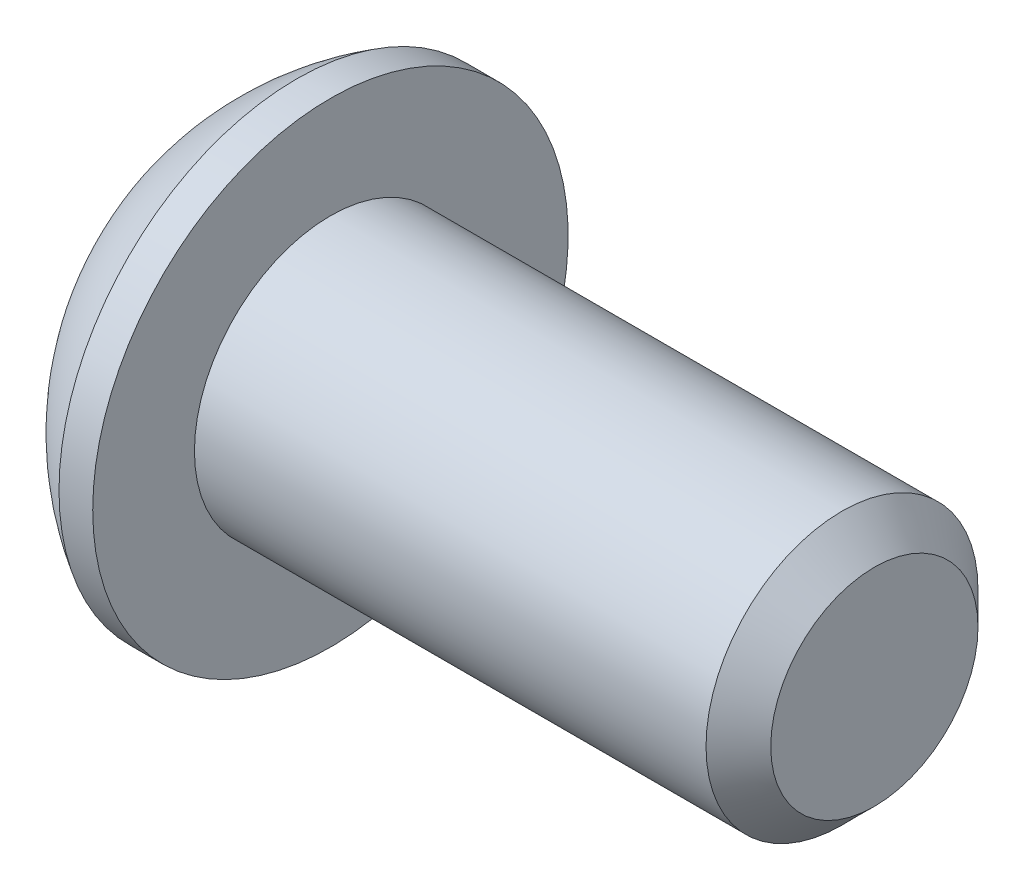
ISO-10303-21;
HEADER;
FILE_DESCRIPTION(('STEP AP214'),'2;1');
FILE_NAME('part.step','',(''),(''),'','','');
FILE_SCHEMA(('AUTOMOTIVE_DESIGN { 1 0 10303 214 1 1 1 1 }'));
ENDSEC;
DATA;
#1=APPLICATION_CONTEXT('core data for automotive mechanical design processes');
#2=APPLICATION_PROTOCOL_DEFINITION('international standard','automotive_design',2000,#1);
#3=PRODUCT_CONTEXT('',#1,'mechanical');
#4=PRODUCT('Part','Part','',(#3));
#5=PRODUCT_RELATED_PRODUCT_CATEGORY('part','',(#4));
#6=PRODUCT_DEFINITION_FORMATION('','',#4);
#7=PRODUCT_DEFINITION_CONTEXT('part definition',#1,'design');
#8=PRODUCT_DEFINITION('design','',#6,#7);
#9=PRODUCT_DEFINITION_SHAPE('','',#8);
#10=(LENGTH_UNIT() NAMED_UNIT(*) SI_UNIT(.MILLI.,.METRE.));
#11=(NAMED_UNIT(*) PLANE_ANGLE_UNIT() SI_UNIT($,.RADIAN.));
#12=(NAMED_UNIT(*) SI_UNIT($,.STERADIAN.) SOLID_ANGLE_UNIT());
#13=UNCERTAINTY_MEASURE_WITH_UNIT(LENGTH_MEASURE(1.E-05),#10,'distance_accuracy_value','');
#14=(GEOMETRIC_REPRESENTATION_CONTEXT(3) GLOBAL_UNCERTAINTY_ASSIGNED_CONTEXT((#13)) GLOBAL_UNIT_ASSIGNED_CONTEXT((#10,
#11,#12)) REPRESENTATION_CONTEXT('',''));
#15=CARTESIAN_POINT('',(0.,0.,0.));
#16=DIRECTION('',(0.,0.,1.));
#17=DIRECTION('',(1.,0.,0.));
#18=AXIS2_PLACEMENT_3D('',#15,#16,#17);
#19=CARTESIAN_POINT('',(0.,0.,0.));
#20=DIRECTION('',(-1.,0.,0.));
#21=DIRECTION('',(0.,0.,1.));
#22=AXIS2_PLACEMENT_3D('',#19,#20,#21);
#23=PLANE('',#22);
#24=CARTESIAN_POINT('',(0.,0.,0.));
#25=DIRECTION('',(-1.,0.,0.));
#26=DIRECTION('',(0.,0.,1.));
#27=AXIS2_PLACEMENT_3D('',#24,#25,#26);
#28=CIRCLE('',#27,2.77495);
#29=CARTESIAN_POINT('',(0.,2.77495,0.));
#30=VERTEX_POINT('',#29);
#31=EDGE_CURVE('E11',#30,#30,#28,.T.);
#32=ORIENTED_EDGE('',*,*,#31,.T.);
#33=EDGE_LOOP('',(#32));
#34=FACE_BOUND('',#33,.T.);
#35=DIRECTION('',(0.,-1.,0.));
#36=VECTOR('',#35,1.);
#37=CARTESIAN_POINT('',(0.,-1.14384635331849,1.9812));
#38=LINE('',#37,#36);
#39=CARTESIAN_POINT('',(0.,1.14384635331849,1.9812));
#40=VERTEX_POINT('',#39);
#41=CARTESIAN_POINT('',(0.,-1.14384635331849,1.9812));
#42=VERTEX_POINT('',#41);
#43=EDGE_CURVE('E47',#40,#42,#38,.T.);
#44=ORIENTED_EDGE('',*,*,#43,.T.);
#45=DIRECTION('',(0.,-0.5,-0.866025403784439));
#46=VECTOR('',#45,1.);
#47=CARTESIAN_POINT('',(0.,-2.28769270663697,0.));
#48=LINE('',#47,#46);
#49=CARTESIAN_POINT('',(0.,-2.28769270663697,0.));
#50=VERTEX_POINT('',#49);
#51=EDGE_CURVE('E368',#42,#50,#48,.T.);
#52=ORIENTED_EDGE('',*,*,#51,.T.);
#53=DIRECTION('',(0.,0.5,-0.866025403784439));
#54=VECTOR('',#53,1.);
#55=CARTESIAN_POINT('',(0.,-1.14384635331849,-1.9812));
#56=LINE('',#55,#54);
#57=CARTESIAN_POINT('',(0.,-1.14384635331849,-1.9812));
#58=VERTEX_POINT('',#57);
#59=EDGE_CURVE('E132',#50,#58,#56,.T.);
#60=ORIENTED_EDGE('',*,*,#59,.T.);
#61=DIRECTION('',(0.,1.,0.));
#62=VECTOR('',#61,1.);
#63=CARTESIAN_POINT('',(0.,1.14384635331849,-1.9812));
#64=LINE('',#63,#62);
#65=CARTESIAN_POINT('',(0.,1.14384635331849,-1.9812));
#66=VERTEX_POINT('',#65);
#67=EDGE_CURVE('E371',#58,#66,#64,.T.);
#68=ORIENTED_EDGE('',*,*,#67,.T.);
#69=DIRECTION('',(0.,0.5,0.866025403784439));
#70=VECTOR('',#69,1.);
#71=CARTESIAN_POINT('',(0.,2.28769270663697,0.));
#72=LINE('',#71,#70);
#73=CARTESIAN_POINT('',(0.,2.28769270663697,0.));
#74=VERTEX_POINT('',#73);
#75=EDGE_CURVE('E373',#66,#74,#72,.T.);
#76=ORIENTED_EDGE('',*,*,#75,.T.);
#77=DIRECTION('',(0.,-0.5,0.866025403784439));
#78=VECTOR('',#77,1.);
#79=CARTESIAN_POINT('',(0.,1.14384635331849,1.9812));
#80=LINE('',#79,#78);
#81=EDGE_CURVE('E375',#74,#40,#80,.T.);
#82=ORIENTED_EDGE('',*,*,#81,.T.);
#83=EDGE_LOOP('',(#44,#52,#60,#68,#76,#82));
#84=FACE_BOUND('',#83,.T.);
#85=ADVANCED_FACE('F33',(#34,#84),#23,.T.);
#86=CARTESIAN_POINT('',(5.78512506188119,0.,0.));
#87=DIRECTION('',(-1.,0.,0.));
#88=DIRECTION('',(0.,1.,0.));
#89=AXIS2_PLACEMENT_3D('',#86,#87,#88);
#90=SPHERICAL_SURFACE('',#89,6.41623094067739);
#91=CARTESIAN_POINT('',(2.5654,0.,0.));
#92=DIRECTION('',(-1.,0.,0.));
#93=DIRECTION('',(0.,0.,1.));
#94=AXIS2_PLACEMENT_3D('',#91,#92,#93);
#95=CIRCLE('',#94,5.5499);
#96=CARTESIAN_POINT('',(2.5654,5.5499,0.));
#97=VERTEX_POINT('',#96);
#98=EDGE_CURVE('E40',#97,#97,#95,.T.);
#99=CARTESIAN_POINT('',(2.5654,5.5499,0.));
#100=CARTESIAN_POINT('',(2.53083708566419,5.52984868712258,0.));
#101=CARTESIAN_POINT('',(2.49646152825914,5.50947442663449,0.));
#102=CARTESIAN_POINT('',(2.42809701945272,5.46808729773921,0.));
#103=CARTESIAN_POINT('',(2.39410806805135,5.44707442933201,0.));
#104=CARTESIAN_POINT('',(2.32652866339446,5.40441737190071,0.));
#105=CARTESIAN_POINT('',(2.29293821013895,5.38277318287661,0.));
#106=CARTESIAN_POINT('',(2.22616751866502,5.33886105159856,0.));
#107=CARTESIAN_POINT('',(2.19298728044662,5.3165931093446,0.));
#108=CARTESIAN_POINT('',(2.12704860244366,5.27144124070729,0.));
#109=CARTESIAN_POINT('',(2.09429016265911,5.24855731432393,0.));
#110=CARTESIAN_POINT('',(2.02920651509859,5.20218146582175,0.));
#111=CARTESIAN_POINT('',(1.99688130732261,5.17868954370292,0.));
#112=CARTESIAN_POINT('',(1.93267540683267,5.13110590319174,0.));
#113=CARTESIAN_POINT('',(1.90079471411871,5.10701418479938,0.));
#114=CARTESIAN_POINT('',(1.83748897146475,5.05823936086599,0.));
#115=CARTESIAN_POINT('',(1.80606392152474,5.03355625532495,0.));
#116=CARTESIAN_POINT('',(1.74368043314138,4.98360727255644,0.));
#117=CARTESIAN_POINT('',(1.71272199469802,4.95834139532897,0.));
#118=CARTESIAN_POINT('',(1.65128253514951,4.90723568808467,0.));
#119=CARTESIAN_POINT('',(1.62080151404435,4.88139585806785,0.));
#120=CARTESIAN_POINT('',(1.56032752837792,4.82915126447053,0.));
#121=CARTESIAN_POINT('',(1.53033456381664,4.80274650089003,0.));
#122=CARTESIAN_POINT('',(1.4708471600897,4.74938125657909,0.));
#123=CARTESIAN_POINT('',(1.44135272092403,4.72242077584864,0.));
#124=CARTESIAN_POINT('',(1.38287266283316,4.6679535076206,0.));
#125=CARTESIAN_POINT('',(1.35388704390797,4.64044672012299,0.));
#126=CARTESIAN_POINT('',(1.29643474354243,4.58489643942842,0.));
#127=CARTESIAN_POINT('',(1.26796806210209,4.55685294623144,0.));
#128=CARTESIAN_POINT('',(1.21156357281885,4.50023904253955,0.));
#129=CARTESIAN_POINT('',(1.18362576497595,4.47166863204464,0.));
#130=CARTESIAN_POINT('',(1.12828877440023,4.41401086607543,0.));
#131=CARTESIAN_POINT('',(1.10088959166741,4.38492351060113,0.));
#132=CARTESIAN_POINT('',(1.04663941482087,4.32624200742802,0.));
#133=CARTESIAN_POINT('',(1.01978842070714,4.2966478597292,0.));
#134=CARTESIAN_POINT('',(0.966643993266067,4.2369631017545,0.));
#135=CARTESIAN_POINT('',(0.940350559938718,4.20687249147862,0.));
#136=CARTESIAN_POINT('',(0.888330431624667,4.14620531128432,0.));
#137=CARTESIAN_POINT('',(0.862603736637965,4.11562874136591,0.));
#138=CARTESIAN_POINT('',(0.811726064743086,4.05400031444217,0.));
#139=CARTESIAN_POINT('',(0.786575087834909,4.02294845743684,0.));
#140=CARTESIAN_POINT('',(0.736857630884289,3.96038029479081,0.));
#141=CARTESIAN_POINT('',(0.712291150841846,3.9288639891501,0.));
#142=CARTESIAN_POINT('',(0.663751262394899,3.8653779297977,0.));
#143=CARTESIAN_POINT('',(0.639777853990395,3.833408176086,0.));
#144=CARTESIAN_POINT('',(0.592432476584126,3.76902637942894,0.));
#145=CARTESIAN_POINT('',(0.569060507582361,3.73661433648358,0.));
#146=CARTESIAN_POINT('',(0.522926166816146,3.67135927457555,0.));
#147=CARTESIAN_POINT('',(0.500163795051695,3.63851625561289,0.));
#148=CARTESIAN_POINT('',(0.455256593824863,3.57241070531295,0.));
#149=CARTESIAN_POINT('',(0.433111764362481,3.53914817397566,0.));
#150=CARTESIAN_POINT('',(0.389447377232277,3.47221520900886,0.));
#151=CARTESIAN_POINT('',(0.367927819564455,3.43854477537934,0.));
#152=CARTESIAN_POINT('',(0.325521487354905,3.37080775824281,0.));
#153=CARTESIAN_POINT('',(0.304634712813177,3.3367411747358,0.));
#154=CARTESIAN_POINT('',(0.263501236996926,3.26822374869429,0.));
#155=CARTESIAN_POINT('',(0.243254535722402,3.23377290615979,0.));
#156=CARTESIAN_POINT('',(0.203408274368181,3.16449898643303,0.));
#157=CARTESIAN_POINT('',(0.183808714288484,3.12967590924076,0.));
#158=CARTESIAN_POINT('',(0.145263572892659,3.05966967674634,0.));
#159=CARTESIAN_POINT('',(0.126317991576532,3.02448652144418,0.));
#160=CARTESIAN_POINT('',(0.0890874337230973,2.95377240655615,0.));
#161=CARTESIAN_POINT('',(0.0708024571857898,2.91824144697028,0.));
#162=CARTESIAN_POINT('',(0.0348994419493877,2.84684415010637,0.));
#163=CARTESIAN_POINT('',(0.0172814032502931,2.81097781282834,0.));
#164=CARTESIAN_POINT('',(0.,2.77495,0.));
#165=B_SPLINE_CURVE_WITH_KNOTS('',3,(#99,#100,#101,#102,#103,#104,#105,#106,#107,#108,#109,#110,
#111,#112,#113,#114,#115,#116,#117,#118,#119,#120,#121,#122,#123,#124,#125,#126,#127,#128,#129,
#130,#131,#132,#133,#134,#135,#136,#137,#138,#139,#140,#141,#142,#143,#144,#145,#146,#147,#148,
#149,#150,#151,#152,#153,#154,#155,#156,#157,#158,#159,#160,#161,#162,#163,#164),.UNSPECIFIED.,
.F.,.F.,(4,2,2,2,2,2,2,2,2,2,2,2,2,2,2,2,2,2,2,2,2,2,2,2,2,2,2,2,2,2,2,2,4),(0.,
0.119872570538485,0.239745141076969,0.359617711615453,0.479490282153938,0.599362852692422,
0.719235423230905,0.83910799376939,0.958980564307875,1.07885313484636,1.19872570538484,
1.31859827592333,1.43847084646181,1.5583434170003,1.67821598753878,1.79808855807726,
1.91796112861575,2.03783369915423,2.15770626969272,2.2775788402312,2.39745141076968,
2.51732398130817,2.63719655184665,2.75706912238514,2.87694169292362,2.99681426346211,
3.11668683400059,3.23655940453908,3.35643197507756,3.47630454561604,3.59617711615453,
3.71604968669301,3.8359222572315),.UNSPECIFIED.);
#166=EDGE_CURVE('BSEAM159',#97,#30,#165,.T.);
#167=ORIENTED_EDGE('',*,*,#98,.T.);
#168=ORIENTED_EDGE('',*,*,#31,.F.);
#169=ORIENTED_EDGE('',*,*,#166,.T.);
#170=ORIENTED_EDGE('',*,*,#166,.F.);
#171=EDGE_LOOP('',(#167,#169,#168,#170));
#172=FACE_BOUND('',#171,.T.);
#173=ADVANCED_FACE('F159',(#172),#90,.T.);
#174=CARTESIAN_POINT('',(0.,0.,0.));
#175=DIRECTION('',(-1.,0.,0.));
#176=DIRECTION('',(0.,0.,1.));
#177=AXIS2_PLACEMENT_3D('',#174,#175,#176);
#178=CYLINDRICAL_SURFACE('',#177,5.5499);
#179=ORIENTED_EDGE('',*,*,#98,.F.);
#180=EDGE_LOOP('',(#179));
#181=FACE_BOUND('',#180,.T.);
#182=CARTESIAN_POINT('',(3.3528,0.,0.));
#183=DIRECTION('',(-1.,0.,0.));
#184=DIRECTION('',(0.,0.,1.));
#185=AXIS2_PLACEMENT_3D('',#182,#183,#184);
#186=CIRCLE('',#185,5.5499);
#187=CARTESIAN_POINT('',(3.3528,0.,5.5499));
#188=VERTEX_POINT('',#187);
#189=EDGE_CURVE('E154',#188,#188,#186,.T.);
#190=ORIENTED_EDGE('',*,*,#189,.T.);
#191=EDGE_LOOP('',(#190));
#192=FACE_BOUND('',#191,.T.);
#193=ADVANCED_FACE('F162',(#181,#192),#178,.T.);
#194=CARTESIAN_POINT('',(3.3528,3.175,0.));
#195=DIRECTION('',(-1.,0.,0.));
#196=DIRECTION('',(0.,0.,1.));
#197=AXIS2_PLACEMENT_3D('',#194,#195,#196);
#198=PLANE('',#197);
#199=ORIENTED_EDGE('',*,*,#189,.F.);
#200=EDGE_LOOP('',(#199));
#201=FACE_BOUND('',#200,.T.);
#202=CARTESIAN_POINT('',(3.3528,0.,0.));
#203=DIRECTION('',(-1.,0.,0.));
#204=DIRECTION('',(0.,0.,1.));
#205=AXIS2_PLACEMENT_3D('',#202,#203,#204);
#206=CIRCLE('',#205,3.175);
#207=CARTESIAN_POINT('',(3.3528,0.,3.175));
#208=VERTEX_POINT('',#207);
#209=EDGE_CURVE('E151',#208,#208,#206,.T.);
#210=ORIENTED_EDGE('',*,*,#209,.T.);
#211=EDGE_LOOP('',(#210));
#212=FACE_BOUND('',#211,.T.);
#213=ADVANCED_FACE('F165',(#201,#212),#198,.F.);
#214=CARTESIAN_POINT('',(0.,0.,0.));
#215=DIRECTION('',(-1.,0.,0.));
#216=DIRECTION('',(0.,0.,1.));
#217=AXIS2_PLACEMENT_3D('',#214,#215,#216);
#218=CYLINDRICAL_SURFACE('',#217,3.175);
#219=ORIENTED_EDGE('',*,*,#209,.F.);
#220=EDGE_LOOP('',(#219));
#221=FACE_BOUND('',#220,.T.);
#222=CARTESIAN_POINT('',(15.29715,0.,0.));
#223=DIRECTION('',(-1.,0.,0.));
#224=DIRECTION('',(0.,0.,1.));
#225=AXIS2_PLACEMENT_3D('',#222,#223,#224);
#226=CIRCLE('',#225,3.175);
#227=CARTESIAN_POINT('',(15.29715,0.,3.175));
#228=VERTEX_POINT('',#227);
#229=EDGE_CURVE('E148',#228,#228,#226,.T.);
#230=ORIENTED_EDGE('',*,*,#229,.T.);
#231=EDGE_LOOP('',(#230));
#232=FACE_BOUND('',#231,.T.);
#233=ADVANCED_FACE('F171',(#221,#232),#218,.T.);
#234=CARTESIAN_POINT('',(16.0528,0.,0.));
#235=DIRECTION('',(-1.,0.,0.));
#236=DIRECTION('',(0.,0.,1.));
#237=AXIS2_PLACEMENT_3D('',#234,#235,#236);
#238=CONICAL_SURFACE('',#237,2.41935,0.785398163397445);
#239=ORIENTED_EDGE('',*,*,#229,.F.);
#240=EDGE_LOOP('',(#239));
#241=FACE_BOUND('',#240,.T.);
#242=CARTESIAN_POINT('',(16.0528,0.,0.));
#243=DIRECTION('',(-1.,0.,0.));
#244=DIRECTION('',(0.,0.,1.));
#245=AXIS2_PLACEMENT_3D('',#242,#243,#244);
#246=CIRCLE('',#245,2.41935);
#247=CARTESIAN_POINT('',(16.0528,0.,2.41935));
#248=VERTEX_POINT('',#247);
#249=EDGE_CURVE('E144',#248,#248,#246,.T.);
#250=ORIENTED_EDGE('',*,*,#249,.T.);
#251=EDGE_LOOP('',(#250));
#252=FACE_BOUND('',#251,.T.);
#253=ADVANCED_FACE('F177',(#241,#252),#238,.T.);
#254=CARTESIAN_POINT('',(16.0528,0.,0.));
#255=DIRECTION('',(-1.,0.,0.));
#256=DIRECTION('',(0.,0.,1.));
#257=AXIS2_PLACEMENT_3D('',#254,#255,#256);
#258=PLANE('',#257);
#259=ORIENTED_EDGE('',*,*,#249,.F.);
#260=EDGE_LOOP('',(#259));
#261=FACE_BOUND('',#260,.T.);
#262=ADVANCED_FACE('F183',(#261),#258,.F.);
#263=CARTESIAN_POINT('',(2.2098,-2.28769270663697,0.));
#264=DIRECTION('',(0.,0.866025403784439,-0.5));
#265=DIRECTION('',(0.,0.5,0.866025403784439));
#266=AXIS2_PLACEMENT_3D('',#263,#264,#265);
#267=PLANE('',#266);
#268=DIRECTION('',(0.,-0.5,-0.866025403784439));
#269=VECTOR('',#268,1.);
#270=CARTESIAN_POINT('',(2.2098,-2.28769270663697,0.));
#271=LINE('',#270,#269);
#272=CARTESIAN_POINT('',(2.2098,-1.14384635331849,1.9812));
#273=VERTEX_POINT('',#272);
#274=CARTESIAN_POINT('',(2.2098,-1.71576952997773,0.990599999999999));
#275=VERTEX_POINT('',#274);
#276=EDGE_CURVE('E115',#273,#275,#271,.T.);
#277=ORIENTED_EDGE('',*,*,#276,.T.);
#278=CARTESIAN_POINT('',(2.2098,-2.28769270663697,0.));
#279=VERTEX_POINT('',#278);
#280=EDGE_CURVE('E108',#275,#279,#271,.T.);
#281=ORIENTED_EDGE('',*,*,#280,.T.);
#282=DIRECTION('',(-1.,0.,0.));
#283=VECTOR('',#282,1.);
#284=CARTESIAN_POINT('',(2.2098,-2.28769270663697,0.));
#285=LINE('',#284,#283);
#286=EDGE_CURVE('E112',#279,#50,#285,.T.);
#287=ORIENTED_EDGE('',*,*,#286,.T.);
#288=ORIENTED_EDGE('',*,*,#51,.F.);
#289=DIRECTION('',(-1.,0.,0.));
#290=VECTOR('',#289,1.);
#291=CARTESIAN_POINT('',(2.2098,-1.14384635331849,1.9812));
#292=LINE('',#291,#290);
#293=EDGE_CURVE('E367',#273,#42,#292,.T.);
#294=ORIENTED_EDGE('',*,*,#293,.F.);
#295=EDGE_LOOP('',(#277,#281,#287,#288,#294));
#296=FACE_BOUND('',#295,.T.);
#297=ADVANCED_FACE('F110',(#296),#267,.T.);
#298=CARTESIAN_POINT('',(2.2098,-1.14384635331849,-1.9812));
#299=DIRECTION('',(0.,0.866025403784439,0.5));
#300=DIRECTION('',(0.,-0.5,0.866025403784439));
#301=AXIS2_PLACEMENT_3D('',#298,#299,#300);
#302=PLANE('',#301);
#303=DIRECTION('',(0.,0.5,-0.866025403784439));
#304=VECTOR('',#303,1.);
#305=CARTESIAN_POINT('',(2.2098,-1.14384635331849,-1.9812));
#306=LINE('',#305,#304);
#307=CARTESIAN_POINT('',(2.2098,-1.71576952997773,-0.990599999999999));
#308=VERTEX_POINT('',#307);
#309=EDGE_CURVE('E120',#279,#308,#306,.T.);
#310=ORIENTED_EDGE('',*,*,#309,.T.);
#311=CARTESIAN_POINT('',(2.2098,-1.14384635331849,-1.9812));
#312=VERTEX_POINT('',#311);
#313=EDGE_CURVE('E127',#308,#312,#306,.T.);
#314=ORIENTED_EDGE('',*,*,#313,.T.);
#315=DIRECTION('',(-1.,0.,0.));
#316=VECTOR('',#315,1.);
#317=CARTESIAN_POINT('',(2.2098,-1.14384635331849,-1.9812));
#318=LINE('',#317,#316);
#319=EDGE_CURVE('E134',#312,#58,#318,.T.);
#320=ORIENTED_EDGE('',*,*,#319,.T.);
#321=ORIENTED_EDGE('',*,*,#59,.F.);
#322=ORIENTED_EDGE('',*,*,#286,.F.);
#323=EDGE_LOOP('',(#310,#314,#320,#321,#322));
#324=FACE_BOUND('',#323,.T.);
#325=ADVANCED_FACE('F130',(#324),#302,.T.);
#326=CARTESIAN_POINT('',(2.2098,1.14384635331849,-1.9812));
#327=DIRECTION('',(0.,0.,1.));
#328=DIRECTION('',(1.,0.,0.));
#329=AXIS2_PLACEMENT_3D('',#326,#327,#328);
#330=PLANE('',#329);
#331=DIRECTION('',(0.,1.,0.));
#332=VECTOR('',#331,1.);
#333=CARTESIAN_POINT('',(2.2098,1.14384635331849,-1.9812));
#334=LINE('',#333,#332);
#335=CARTESIAN_POINT('',(2.2098,0.,-1.9812));
#336=VERTEX_POINT('',#335);
#337=EDGE_CURVE('E392',#312,#336,#334,.T.);
#338=ORIENTED_EDGE('',*,*,#337,.T.);
#339=CARTESIAN_POINT('',(2.2098,1.14384635331849,-1.9812));
#340=VERTEX_POINT('',#339);
#341=EDGE_CURVE('E126',#336,#340,#334,.T.);
#342=ORIENTED_EDGE('',*,*,#341,.T.);
#343=DIRECTION('',(-1.,0.,0.));
#344=VECTOR('',#343,1.);
#345=CARTESIAN_POINT('',(2.2098,1.14384635331849,-1.9812));
#346=LINE('',#345,#344);
#347=EDGE_CURVE('E139',#340,#66,#346,.T.);
#348=ORIENTED_EDGE('',*,*,#347,.T.);
#349=ORIENTED_EDGE('',*,*,#67,.F.);
#350=ORIENTED_EDGE('',*,*,#319,.F.);
#351=EDGE_LOOP('',(#338,#342,#348,#349,#350));
#352=FACE_BOUND('',#351,.T.);
#353=ADVANCED_FACE('F242',(#352),#330,.T.);
#354=CARTESIAN_POINT('',(2.2098,2.28769270663697,0.));
#355=DIRECTION('',(0.,-0.866025403784439,0.5));
#356=DIRECTION('',(0.,-0.5,-0.866025403784439));
#357=AXIS2_PLACEMENT_3D('',#354,#355,#356);
#358=PLANE('',#357);
#359=DIRECTION('',(0.,0.5,0.866025403784439));
#360=VECTOR('',#359,1.);
#361=CARTESIAN_POINT('',(2.2098,2.28769270663697,0.));
#362=LINE('',#361,#360);
#363=CARTESIAN_POINT('',(2.2098,1.71576952997773,-0.9906));
#364=VERTEX_POINT('',#363);
#365=EDGE_CURVE('E354',#340,#364,#362,.T.);
#366=ORIENTED_EDGE('',*,*,#365,.T.);
#367=CARTESIAN_POINT('',(2.2098,2.28769270663697,0.));
#368=VERTEX_POINT('',#367);
#369=EDGE_CURVE('E394',#364,#368,#362,.T.);
#370=ORIENTED_EDGE('',*,*,#369,.T.);
#371=DIRECTION('',(-1.,0.,0.));
#372=VECTOR('',#371,1.);
#373=CARTESIAN_POINT('',(2.2098,2.28769270663697,0.));
#374=LINE('',#373,#372);
#375=EDGE_CURVE('E360',#368,#74,#374,.T.);
#376=ORIENTED_EDGE('',*,*,#375,.T.);
#377=ORIENTED_EDGE('',*,*,#75,.F.);
#378=ORIENTED_EDGE('',*,*,#347,.F.);
#379=EDGE_LOOP('',(#366,#370,#376,#377,#378));
#380=FACE_BOUND('',#379,.T.);
#381=ADVANCED_FACE('F251',(#380),#358,.T.);
#382=CARTESIAN_POINT('',(2.2098,1.14384635331849,1.9812));
#383=DIRECTION('',(0.,-0.866025403784439,-0.5));
#384=DIRECTION('',(0.,0.5,-0.866025403784439));
#385=AXIS2_PLACEMENT_3D('',#382,#383,#384);
#386=PLANE('',#385);
#387=DIRECTION('',(0.,-0.5,0.866025403784439));
#388=VECTOR('',#387,1.);
#389=CARTESIAN_POINT('',(2.2098,1.14384635331849,1.9812));
#390=LINE('',#389,#388);
#391=CARTESIAN_POINT('',(2.2098,1.71576952997773,0.990600000000001));
#392=VERTEX_POINT('',#391);
#393=EDGE_CURVE('E353',#368,#392,#390,.T.);
#394=ORIENTED_EDGE('',*,*,#393,.T.);
#395=CARTESIAN_POINT('',(2.2098,1.14384635331849,1.9812));
#396=VERTEX_POINT('',#395);
#397=EDGE_CURVE('E350',#392,#396,#390,.T.);
#398=ORIENTED_EDGE('',*,*,#397,.T.);
#399=DIRECTION('',(-1.,0.,0.));
#400=VECTOR('',#399,1.);
#401=CARTESIAN_POINT('',(2.2098,1.14384635331849,1.9812));
#402=LINE('',#401,#400);
#403=EDGE_CURVE('E380',#396,#40,#402,.T.);
#404=ORIENTED_EDGE('',*,*,#403,.T.);
#405=ORIENTED_EDGE('',*,*,#81,.F.);
#406=ORIENTED_EDGE('',*,*,#375,.F.);
#407=EDGE_LOOP('',(#394,#398,#404,#405,#406));
#408=FACE_BOUND('',#407,.T.);
#409=ADVANCED_FACE('F261',(#408),#386,.T.);
#410=CARTESIAN_POINT('',(2.2098,-1.14384635331849,1.9812));
#411=DIRECTION('',(0.,0.,-1.));
#412=DIRECTION('',(0.,1.,0.));
#413=AXIS2_PLACEMENT_3D('',#410,#411,#412);
#414=PLANE('',#413);
#415=DIRECTION('',(0.,-1.,0.));
#416=VECTOR('',#415,1.);
#417=CARTESIAN_POINT('',(2.2098,-1.14384635331849,1.9812));
#418=LINE('',#417,#416);
#419=CARTESIAN_POINT('',(2.2098,0.,1.9812));
#420=VERTEX_POINT('',#419);
#421=EDGE_CURVE('E55',#396,#420,#418,.T.);
#422=ORIENTED_EDGE('',*,*,#421,.T.);
#423=EDGE_CURVE('E362',#420,#273,#418,.T.);
#424=ORIENTED_EDGE('',*,*,#423,.T.);
#425=ORIENTED_EDGE('',*,*,#293,.T.);
#426=ORIENTED_EDGE('',*,*,#43,.F.);
#427=ORIENTED_EDGE('',*,*,#403,.F.);
#428=EDGE_LOOP('',(#422,#424,#425,#426,#427));
#429=FACE_BOUND('',#428,.T.);
#430=ADVANCED_FACE('F271',(#429),#414,.T.);
#431=CARTESIAN_POINT('',(2.2098,-1.14384635331849,1.9812));
#432=DIRECTION('',(-1.,0.,0.));
#433=DIRECTION('',(0.,0.,1.));
#434=AXIS2_PLACEMENT_3D('',#431,#432,#433);
#435=PLANE('',#434);
#436=ORIENTED_EDGE('',*,*,#421,.F.);
#437=ORIENTED_EDGE('',*,*,#397,.F.);
#438=CARTESIAN_POINT('',(2.2098,0.,0.));
#439=DIRECTION('',(-1.,0.,0.));
#440=DIRECTION('',(0.,0.,1.));
#441=AXIS2_PLACEMENT_3D('',#438,#439,#440);
#442=CIRCLE('',#441,1.9812);
#443=EDGE_CURVE('E138',#420,#392,#442,.T.);
#444=ORIENTED_EDGE('',*,*,#443,.F.);
#445=EDGE_LOOP('',(#436,#437,#444));
#446=FACE_BOUND('',#445,.T.);
#447=ADVANCED_FACE('F281',(#446),#435,.T.);
#448=ORIENTED_EDGE('',*,*,#393,.F.);
#449=ORIENTED_EDGE('',*,*,#369,.F.);
#450=EDGE_CURVE('E145',#392,#364,#442,.T.);
#451=ORIENTED_EDGE('',*,*,#450,.F.);
#452=EDGE_LOOP('',(#448,#449,#451));
#453=FACE_BOUND('',#452,.T.);
#454=ADVANCED_FACE('F290',(#453),#435,.T.);
#455=ORIENTED_EDGE('',*,*,#365,.F.);
#456=ORIENTED_EDGE('',*,*,#341,.F.);
#457=EDGE_CURVE('E395',#364,#336,#442,.T.);
#458=ORIENTED_EDGE('',*,*,#457,.F.);
#459=EDGE_LOOP('',(#455,#456,#458));
#460=FACE_BOUND('',#459,.T.);
#461=ADVANCED_FACE('F301',(#460),#435,.T.);
#462=ORIENTED_EDGE('',*,*,#337,.F.);
#463=ORIENTED_EDGE('',*,*,#313,.F.);
#464=EDGE_CURVE('E393',#336,#308,#442,.T.);
#465=ORIENTED_EDGE('',*,*,#464,.F.);
#466=EDGE_LOOP('',(#462,#463,#465));
#467=FACE_BOUND('',#466,.T.);
#468=ADVANCED_FACE('F310',(#467),#435,.T.);
#469=ORIENTED_EDGE('',*,*,#309,.F.);
#470=ORIENTED_EDGE('',*,*,#280,.F.);
#471=EDGE_CURVE('E122',#308,#275,#442,.T.);
#472=ORIENTED_EDGE('',*,*,#471,.F.);
#473=EDGE_LOOP('',(#469,#470,#472));
#474=FACE_BOUND('',#473,.T.);
#475=ADVANCED_FACE('F121',(#474),#435,.T.);
#476=ORIENTED_EDGE('',*,*,#276,.F.);
#477=ORIENTED_EDGE('',*,*,#423,.F.);
#478=EDGE_CURVE('E133',#275,#420,#442,.T.);
#479=ORIENTED_EDGE('',*,*,#478,.F.);
#480=EDGE_LOOP('',(#476,#477,#479));
#481=FACE_BOUND('',#480,.T.);
#482=ADVANCED_FACE('F293',(#481),#435,.T.);
#483=CARTESIAN_POINT('',(3.3536463533185,0.,0.));
#484=DIRECTION('',(-1.,0.,0.));
#485=DIRECTION('',(0.,0.,1.));
#486=AXIS2_PLACEMENT_3D('',#483,#484,#485);
#487=CONICAL_SURFACE('',#486,0.,1.04719755119659);
#488=ORIENTED_EDGE('',*,*,#443,.T.);
#489=ORIENTED_EDGE('',*,*,#450,.T.);
#490=ORIENTED_EDGE('',*,*,#457,.T.);
#491=ORIENTED_EDGE('',*,*,#464,.T.);
#492=ORIENTED_EDGE('',*,*,#471,.T.);
#493=ORIENTED_EDGE('',*,*,#478,.T.);
#494=EDGE_LOOP('',(#488,#489,#490,#491,#492,#493));
#495=FACE_BOUND('',#494,.T.);
#496=CARTESIAN_POINT('',(3.3536463533185,0.,0.));
#497=VERTEX_POINT('',#496);
#498=VERTEX_LOOP('',#497);
#499=FACE_BOUND('',#498,.T.);
#500=ADVANCED_FACE('F334',(#495,#499),#487,.F.);
#501=CLOSED_SHELL('',(#85,#173,#193,#213,#233,#253,#262,#297,#325,#353,#381,#409,#430,#447,#454,
#461,#468,#475,#482,#500));
#502=MANIFOLD_SOLID_BREP('B2',#501);
#503=ADVANCED_BREP_SHAPE_REPRESENTATION('',(#18,#502),#14);
#504=SHAPE_DEFINITION_REPRESENTATION(#9,#503);
ENDSEC;
END-ISO-10303-21;
